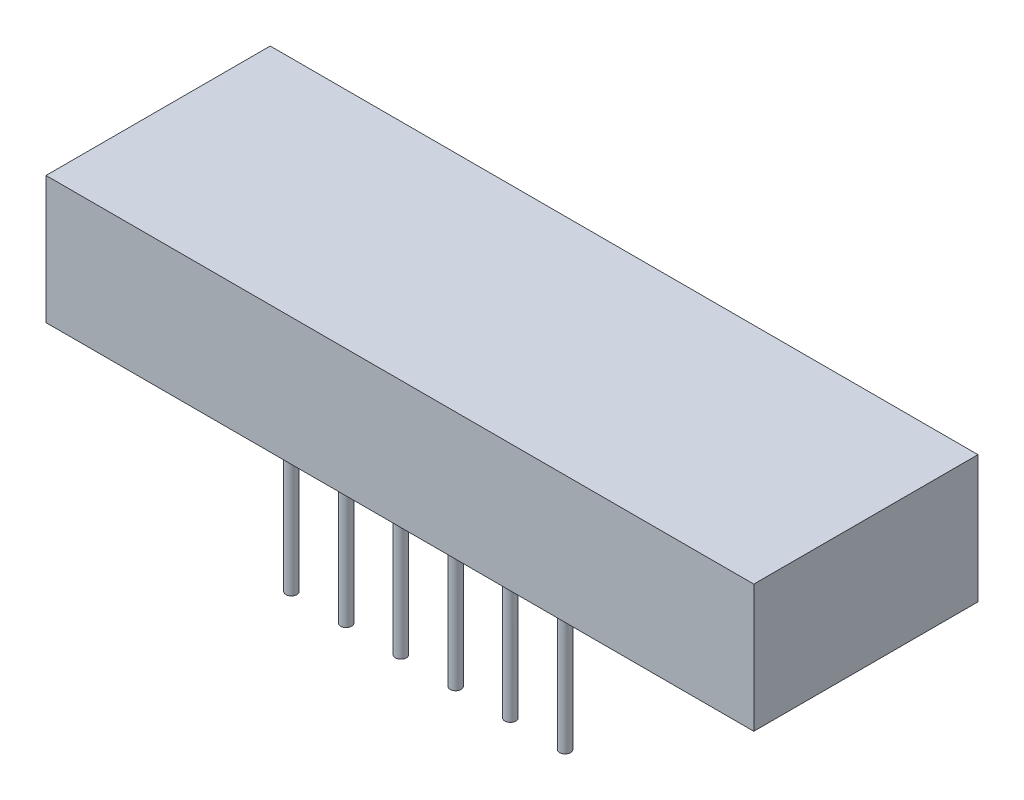
ISO-10303-21;
HEADER;
FILE_DESCRIPTION(('STEP AP214'),'2;1');
FILE_NAME('part.step','',(''),(''),'','','');
FILE_SCHEMA(('AUTOMOTIVE_DESIGN { 1 0 10303 214 1 1 1 1 }'));
ENDSEC;
DATA;
#1=APPLICATION_CONTEXT('core data for automotive mechanical design processes');
#2=APPLICATION_PROTOCOL_DEFINITION('international standard','automotive_design',2000,#1);
#3=PRODUCT_CONTEXT('',#1,'mechanical');
#4=PRODUCT('Part','Part','',(#3));
#5=PRODUCT_RELATED_PRODUCT_CATEGORY('part','',(#4));
#6=PRODUCT_DEFINITION_FORMATION('','',#4);
#7=PRODUCT_DEFINITION_CONTEXT('part definition',#1,'design');
#8=PRODUCT_DEFINITION('design','',#6,#7);
#9=PRODUCT_DEFINITION_SHAPE('','',#8);
#10=(LENGTH_UNIT() NAMED_UNIT(*) SI_UNIT(.MILLI.,.METRE.));
#11=(NAMED_UNIT(*) PLANE_ANGLE_UNIT() SI_UNIT($,.RADIAN.));
#12=(NAMED_UNIT(*) SI_UNIT($,.STERADIAN.) SOLID_ANGLE_UNIT());
#13=UNCERTAINTY_MEASURE_WITH_UNIT(LENGTH_MEASURE(1.E-05),#10,'distance_accuracy_value','');
#14=(GEOMETRIC_REPRESENTATION_CONTEXT(3) GLOBAL_UNCERTAINTY_ASSIGNED_CONTEXT((#13)) GLOBAL_UNIT_ASSIGNED_CONTEXT((#10,
#11,#12)) REPRESENTATION_CONTEXT('',''));
#15=CARTESIAN_POINT('',(0.,0.,0.));
#16=DIRECTION('',(0.,0.,1.));
#17=DIRECTION('',(1.,0.,0.));
#18=AXIS2_PLACEMENT_3D('',#15,#16,#17);
#19=CARTESIAN_POINT('',(-16.1,0.,-5.1));
#20=DIRECTION('',(0.,1.,0.));
#21=DIRECTION('',(0.,0.,1.));
#22=AXIS2_PLACEMENT_3D('',#19,#20,#21);
#23=PLANE('',#22);
#24=CARTESIAN_POINT('',(3.73481199421592,0.,-3.81));
#25=DIRECTION('',(0.,1.,0.));
#26=DIRECTION('',(0.,0.,1.));
#27=AXIS2_PLACEMENT_3D('',#24,#25,#26);
#28=CIRCLE('',#27,0.250000000000001);
#29=CARTESIAN_POINT('',(3.73481199421592,0.,-3.56));
#30=VERTEX_POINT('',#29);
#31=EDGE_CURVE('E42',#30,#30,#28,.F.);
#32=ORIENTED_EDGE('',*,*,#31,.F.);
#33=EDGE_LOOP('',(#32));
#34=FACE_BOUND('',#33,.T.);
#35=CARTESIAN_POINT('',(-1.2449373314053,0.,-3.81000000000001));
#36=DIRECTION('',(0.,1.,0.));
#37=DIRECTION('',(0.,0.,1.));
#38=AXIS2_PLACEMENT_3D('',#35,#36,#37);
#39=CIRCLE('',#38,0.25);
#40=CARTESIAN_POINT('',(-1.2449373314053,0.,-3.56));
#41=VERTEX_POINT('',#40);
#42=EDGE_CURVE('E135',#41,#41,#39,.F.);
#43=ORIENTED_EDGE('',*,*,#42,.F.);
#44=EDGE_LOOP('',(#43));
#45=FACE_BOUND('',#44,.T.);
#46=CARTESIAN_POINT('',(-6.22468665702653,0.,-3.81000000000001));
#47=DIRECTION('',(0.,1.,0.));
#48=DIRECTION('',(0.,0.,1.));
#49=AXIS2_PLACEMENT_3D('',#46,#47,#48);
#50=CIRCLE('',#49,0.25);
#51=CARTESIAN_POINT('',(-6.22468665702653,0.,-3.56));
#52=VERTEX_POINT('',#51);
#53=EDGE_CURVE('E129',#52,#52,#50,.F.);
#54=ORIENTED_EDGE('',*,*,#53,.F.);
#55=EDGE_LOOP('',(#54));
#56=FACE_BOUND('',#55,.T.);
#57=CARTESIAN_POINT('',(-3.73481199421592,0.,3.81));
#58=DIRECTION('',(0.,1.,0.));
#59=DIRECTION('',(0.,0.,1.));
#60=AXIS2_PLACEMENT_3D('',#57,#58,#59);
#61=CIRCLE('',#60,0.25);
#62=CARTESIAN_POINT('',(-3.73481199421592,0.,4.06));
#63=VERTEX_POINT('',#62);
#64=EDGE_CURVE('E123',#63,#63,#61,.F.);
#65=ORIENTED_EDGE('',*,*,#64,.F.);
#66=EDGE_LOOP('',(#65));
#67=FACE_BOUND('',#66,.T.);
#68=CARTESIAN_POINT('',(1.2449373314053,0.,3.81));
#69=DIRECTION('',(0.,1.,0.));
#70=DIRECTION('',(0.,0.,1.));
#71=AXIS2_PLACEMENT_3D('',#68,#69,#70);
#72=CIRCLE('',#71,0.25);
#73=CARTESIAN_POINT('',(1.2449373314053,0.,4.06));
#74=VERTEX_POINT('',#73);
#75=EDGE_CURVE('E117',#74,#74,#72,.F.);
#76=ORIENTED_EDGE('',*,*,#75,.F.);
#77=EDGE_LOOP('',(#76));
#78=FACE_BOUND('',#77,.T.);
#79=CARTESIAN_POINT('',(6.22468665702653,0.,3.81));
#80=DIRECTION('',(0.,1.,0.));
#81=DIRECTION('',(0.,0.,1.));
#82=AXIS2_PLACEMENT_3D('',#79,#80,#81);
#83=CIRCLE('',#82,0.25);
#84=CARTESIAN_POINT('',(6.22468665702653,0.,4.06));
#85=VERTEX_POINT('',#84);
#86=EDGE_CURVE('E111',#85,#85,#83,.F.);
#87=ORIENTED_EDGE('',*,*,#86,.F.);
#88=EDGE_LOOP('',(#87));
#89=FACE_BOUND('',#88,.T.);
#90=DIRECTION('',(0.,0.,1.));
#91=VECTOR('',#90,1.);
#92=CARTESIAN_POINT('',(-16.1,0.,-5.1));
#93=LINE('',#92,#91);
#94=CARTESIAN_POINT('',(-16.1,0.,-5.1));
#95=VERTEX_POINT('',#94);
#96=CARTESIAN_POINT('',(-16.1,0.,5.1));
#97=VERTEX_POINT('',#96);
#98=EDGE_CURVE('E101',#95,#97,#93,.T.);
#99=ORIENTED_EDGE('',*,*,#98,.F.);
#100=DIRECTION('',(-1.,0.,0.));
#101=VECTOR('',#100,1.);
#102=CARTESIAN_POINT('',(-16.1,0.,-5.1));
#103=LINE('',#102,#101);
#104=CARTESIAN_POINT('',(16.1,0.,-5.1));
#105=VERTEX_POINT('',#104);
#106=EDGE_CURVE('E73',#105,#95,#103,.T.);
#107=ORIENTED_EDGE('',*,*,#106,.F.);
#108=DIRECTION('',(0.,0.,-1.));
#109=VECTOR('',#108,1.);
#110=CARTESIAN_POINT('',(16.1,0.,-5.1));
#111=LINE('',#110,#109);
#112=CARTESIAN_POINT('',(16.1,0.,5.1));
#113=VERTEX_POINT('',#112);
#114=EDGE_CURVE('E67',#113,#105,#111,.T.);
#115=ORIENTED_EDGE('',*,*,#114,.F.);
#116=DIRECTION('',(1.,0.,0.));
#117=VECTOR('',#116,1.);
#118=CARTESIAN_POINT('',(-16.1,0.,5.1));
#119=LINE('',#118,#117);
#120=EDGE_CURVE('E91',#97,#113,#119,.T.);
#121=ORIENTED_EDGE('',*,*,#120,.F.);
#122=EDGE_LOOP('',(#99,#107,#115,#121));
#123=FACE_BOUND('',#122,.T.);
#124=CARTESIAN_POINT('',(3.73481199421592,0.,3.81));
#125=DIRECTION('',(0.,1.,0.));
#126=DIRECTION('',(0.,0.,1.));
#127=AXIS2_PLACEMENT_3D('',#124,#125,#126);
#128=CIRCLE('',#127,0.250000000000001);
#129=CARTESIAN_POINT('',(3.73481199421592,0.,4.06));
#130=VERTEX_POINT('',#129);
#131=EDGE_CURVE('E114',#130,#130,#128,.F.);
#132=ORIENTED_EDGE('',*,*,#131,.F.);
#133=EDGE_LOOP('',(#132));
#134=FACE_BOUND('',#133,.T.);
#135=CARTESIAN_POINT('',(-1.24493733140531,0.,3.81));
#136=DIRECTION('',(0.,1.,0.));
#137=DIRECTION('',(0.,0.,1.));
#138=AXIS2_PLACEMENT_3D('',#135,#136,#137);
#139=CIRCLE('',#138,0.25);
#140=CARTESIAN_POINT('',(-1.24493733140531,0.,4.06));
#141=VERTEX_POINT('',#140);
#142=EDGE_CURVE('E120',#141,#141,#139,.F.);
#143=ORIENTED_EDGE('',*,*,#142,.F.);
#144=EDGE_LOOP('',(#143));
#145=FACE_BOUND('',#144,.T.);
#146=CARTESIAN_POINT('',(-6.22468665702653,0.,3.81));
#147=DIRECTION('',(0.,1.,0.));
#148=DIRECTION('',(0.,0.,1.));
#149=AXIS2_PLACEMENT_3D('',#146,#147,#148);
#150=CIRCLE('',#149,0.25);
#151=CARTESIAN_POINT('',(-6.22468665702653,0.,4.06));
#152=VERTEX_POINT('',#151);
#153=EDGE_CURVE('E126',#152,#152,#150,.F.);
#154=ORIENTED_EDGE('',*,*,#153,.F.);
#155=EDGE_LOOP('',(#154));
#156=FACE_BOUND('',#155,.T.);
#157=CARTESIAN_POINT('',(-3.73481199421592,0.,-3.81000000000001));
#158=DIRECTION('',(0.,1.,0.));
#159=DIRECTION('',(0.,0.,1.));
#160=AXIS2_PLACEMENT_3D('',#157,#158,#159);
#161=CIRCLE('',#160,0.25);
#162=CARTESIAN_POINT('',(-3.73481199421592,0.,-3.56));
#163=VERTEX_POINT('',#162);
#164=EDGE_CURVE('E132',#163,#163,#161,.F.);
#165=ORIENTED_EDGE('',*,*,#164,.F.);
#166=EDGE_LOOP('',(#165));
#167=FACE_BOUND('',#166,.T.);
#168=CARTESIAN_POINT('',(1.24493733140531,0.,-3.81000000000001));
#169=DIRECTION('',(0.,1.,0.));
#170=DIRECTION('',(0.,0.,1.));
#171=AXIS2_PLACEMENT_3D('',#168,#169,#170);
#172=CIRCLE('',#171,0.25);
#173=CARTESIAN_POINT('',(1.24493733140531,0.,-3.56));
#174=VERTEX_POINT('',#173);
#175=EDGE_CURVE('E138',#174,#174,#172,.F.);
#176=ORIENTED_EDGE('',*,*,#175,.F.);
#177=EDGE_LOOP('',(#176));
#178=FACE_BOUND('',#177,.T.);
#179=CARTESIAN_POINT('',(6.22468665702653,0.,-3.81000000000001));
#180=DIRECTION('',(0.,1.,0.));
#181=DIRECTION('',(0.,0.,1.));
#182=AXIS2_PLACEMENT_3D('',#179,#180,#181);
#183=CIRCLE('',#182,0.25);
#184=CARTESIAN_POINT('',(6.22468665702653,0.,-3.56));
#185=VERTEX_POINT('',#184);
#186=EDGE_CURVE('E11',#185,#185,#183,.F.);
#187=ORIENTED_EDGE('',*,*,#186,.F.);
#188=EDGE_LOOP('',(#187));
#189=FACE_BOUND('',#188,.T.);
#190=ADVANCED_FACE('F33',(#34,#45,#56,#67,#78,#89,#123,#134,#145,#156,#167,#178,#189),#23,.F.);
#191=CARTESIAN_POINT('',(-16.1,5.8,-5.1));
#192=DIRECTION('',(1.,0.,0.));
#193=DIRECTION('',(0.,0.,-1.));
#194=AXIS2_PLACEMENT_3D('',#191,#192,#193);
#195=PLANE('',#194);
#196=ORIENTED_EDGE('',*,*,#98,.T.);
#197=DIRECTION('',(0.,-1.,0.));
#198=VECTOR('',#197,1.);
#199=CARTESIAN_POINT('',(-16.1,5.8,5.1));
#200=LINE('',#199,#198);
#201=CARTESIAN_POINT('',(-16.1,5.8,5.1));
#202=VERTEX_POINT('',#201);
#203=EDGE_CURVE('E92',#202,#97,#200,.T.);
#204=ORIENTED_EDGE('',*,*,#203,.F.);
#205=DIRECTION('',(0.,0.,1.));
#206=VECTOR('',#205,1.);
#207=CARTESIAN_POINT('',(-16.1,5.8,-5.1));
#208=LINE('',#207,#206);
#209=CARTESIAN_POINT('',(-16.1,5.8,-5.1));
#210=VERTEX_POINT('',#209);
#211=EDGE_CURVE('E86',#210,#202,#208,.T.);
#212=ORIENTED_EDGE('',*,*,#211,.F.);
#213=DIRECTION('',(0.,-1.,0.));
#214=VECTOR('',#213,1.);
#215=CARTESIAN_POINT('',(-16.1,5.8,-5.1));
#216=LINE('',#215,#214);
#217=EDGE_CURVE('E97',#210,#95,#216,.T.);
#218=ORIENTED_EDGE('',*,*,#217,.T.);
#219=EDGE_LOOP('',(#196,#204,#212,#218));
#220=FACE_BOUND('',#219,.T.);
#221=ADVANCED_FACE('F35',(#220),#195,.F.);
#222=CARTESIAN_POINT('',(-16.1,5.8,5.1));
#223=DIRECTION('',(0.,0.,-1.));
#224=DIRECTION('',(-1.,0.,0.));
#225=AXIS2_PLACEMENT_3D('',#222,#223,#224);
#226=PLANE('',#225);
#227=ORIENTED_EDGE('',*,*,#120,.T.);
#228=DIRECTION('',(0.,-1.,0.));
#229=VECTOR('',#228,1.);
#230=CARTESIAN_POINT('',(16.1,5.8,5.1));
#231=LINE('',#230,#229);
#232=CARTESIAN_POINT('',(16.1,5.8,5.1));
#233=VERTEX_POINT('',#232);
#234=EDGE_CURVE('E89',#233,#113,#231,.T.);
#235=ORIENTED_EDGE('',*,*,#234,.F.);
#236=DIRECTION('',(1.,0.,0.));
#237=VECTOR('',#236,1.);
#238=CARTESIAN_POINT('',(-16.1,5.8,5.1));
#239=LINE('',#238,#237);
#240=EDGE_CURVE('E81',#202,#233,#239,.T.);
#241=ORIENTED_EDGE('',*,*,#240,.F.);
#242=ORIENTED_EDGE('',*,*,#203,.T.);
#243=EDGE_LOOP('',(#227,#235,#241,#242));
#244=FACE_BOUND('',#243,.T.);
#245=ADVANCED_FACE('F90',(#244),#226,.F.);
#246=CARTESIAN_POINT('',(16.1,5.8,-5.1));
#247=DIRECTION('',(-1.,0.,0.));
#248=DIRECTION('',(0.,0.,1.));
#249=AXIS2_PLACEMENT_3D('',#246,#247,#248);
#250=PLANE('',#249);
#251=ORIENTED_EDGE('',*,*,#114,.T.);
#252=DIRECTION('',(0.,-1.,0.));
#253=VECTOR('',#252,1.);
#254=CARTESIAN_POINT('',(16.1,5.8,-5.1));
#255=LINE('',#254,#253);
#256=CARTESIAN_POINT('',(16.1,5.8,-5.1));
#257=VERTEX_POINT('',#256);
#258=EDGE_CURVE('E93',#257,#105,#255,.T.);
#259=ORIENTED_EDGE('',*,*,#258,.F.);
#260=DIRECTION('',(0.,0.,-1.));
#261=VECTOR('',#260,1.);
#262=CARTESIAN_POINT('',(16.1,5.8,-5.1));
#263=LINE('',#262,#261);
#264=EDGE_CURVE('E84',#233,#257,#263,.T.);
#265=ORIENTED_EDGE('',*,*,#264,.F.);
#266=ORIENTED_EDGE('',*,*,#234,.T.);
#267=EDGE_LOOP('',(#251,#259,#265,#266));
#268=FACE_BOUND('',#267,.T.);
#269=ADVANCED_FACE('F95',(#268),#250,.F.);
#270=CARTESIAN_POINT('',(-16.1,5.8,-5.1));
#271=DIRECTION('',(0.,0.,1.));
#272=DIRECTION('',(1.,0.,0.));
#273=AXIS2_PLACEMENT_3D('',#270,#271,#272);
#274=PLANE('',#273);
#275=ORIENTED_EDGE('',*,*,#106,.T.);
#276=ORIENTED_EDGE('',*,*,#217,.F.);
#277=DIRECTION('',(-1.,0.,0.));
#278=VECTOR('',#277,1.);
#279=CARTESIAN_POINT('',(-16.1,5.8,-5.1));
#280=LINE('',#279,#278);
#281=EDGE_CURVE('E50',#257,#210,#280,.T.);
#282=ORIENTED_EDGE('',*,*,#281,.F.);
#283=ORIENTED_EDGE('',*,*,#258,.T.);
#284=EDGE_LOOP('',(#275,#276,#282,#283));
#285=FACE_BOUND('',#284,.T.);
#286=ADVANCED_FACE('F272',(#285),#274,.F.);
#287=CARTESIAN_POINT('',(-16.1,5.8,-5.1));
#288=DIRECTION('',(0.,1.,0.));
#289=DIRECTION('',(0.,0.,1.));
#290=AXIS2_PLACEMENT_3D('',#287,#288,#289);
#291=PLANE('',#290);
#292=ORIENTED_EDGE('',*,*,#211,.T.);
#293=ORIENTED_EDGE('',*,*,#240,.T.);
#294=ORIENTED_EDGE('',*,*,#264,.T.);
#295=ORIENTED_EDGE('',*,*,#281,.T.);
#296=EDGE_LOOP('',(#292,#293,#294,#295));
#297=FACE_BOUND('',#296,.T.);
#298=ADVANCED_FACE('F82',(#297),#291,.T.);
#299=CARTESIAN_POINT('',(6.22468665702653,-6.3,3.81));
#300=DIRECTION('',(0.,1.,0.));
#301=DIRECTION('',(0.,0.,1.));
#302=AXIS2_PLACEMENT_3D('',#299,#300,#301);
#303=CYLINDRICAL_SURFACE('',#302,0.25);
#304=CARTESIAN_POINT('',(6.22468665702653,-6.3,3.81));
#305=DIRECTION('',(0.,-1.,0.));
#306=DIRECTION('',(0.,0.,-1.));
#307=AXIS2_PLACEMENT_3D('',#304,#305,#306);
#308=CIRCLE('',#307,0.25);
#309=CARTESIAN_POINT('',(6.22468665702653,-6.3,3.56));
#310=VERTEX_POINT('',#309);
#311=EDGE_CURVE('E104',#310,#310,#308,.T.);
#312=ORIENTED_EDGE('',*,*,#311,.F.);
#313=EDGE_LOOP('',(#312));
#314=FACE_BOUND('',#313,.T.);
#315=ORIENTED_EDGE('',*,*,#86,.T.);
#316=EDGE_LOOP('',(#315));
#317=FACE_BOUND('',#316,.T.);
#318=ADVANCED_FACE('F266',(#314,#317),#303,.T.);
#319=CARTESIAN_POINT('',(6.22468665702653,-6.3,3.81));
#320=DIRECTION('',(0.,-1.,0.));
#321=DIRECTION('',(0.,0.,-1.));
#322=AXIS2_PLACEMENT_3D('',#319,#320,#321);
#323=PLANE('',#322);
#324=ORIENTED_EDGE('',*,*,#311,.T.);
#325=EDGE_LOOP('',(#324));
#326=FACE_BOUND('',#325,.T.);
#327=ADVANCED_FACE('F262',(#326),#323,.T.);
#328=CARTESIAN_POINT('',(3.73481199421592,-6.3,3.81));
#329=DIRECTION('',(0.,1.,0.));
#330=DIRECTION('',(0.,0.,1.));
#331=AXIS2_PLACEMENT_3D('',#328,#329,#330);
#332=CYLINDRICAL_SURFACE('',#331,0.250000000000001);
#333=CARTESIAN_POINT('',(3.73481199421592,-6.3,3.81));
#334=DIRECTION('',(0.,-1.,0.));
#335=DIRECTION('',(0.,0.,-1.));
#336=AXIS2_PLACEMENT_3D('',#333,#334,#335);
#337=CIRCLE('',#336,0.250000000000001);
#338=CARTESIAN_POINT('',(3.73481199421592,-6.3,3.56));
#339=VERTEX_POINT('',#338);
#340=EDGE_CURVE('E287',#339,#339,#337,.T.);
#341=ORIENTED_EDGE('',*,*,#340,.F.);
#342=EDGE_LOOP('',(#341));
#343=FACE_BOUND('',#342,.T.);
#344=ORIENTED_EDGE('',*,*,#131,.T.);
#345=EDGE_LOOP('',(#344));
#346=FACE_BOUND('',#345,.T.);
#347=ADVANCED_FACE('F258',(#343,#346),#332,.T.);
#348=CARTESIAN_POINT('',(3.73481199421592,-6.3,3.81));
#349=DIRECTION('',(0.,-1.,0.));
#350=DIRECTION('',(0.,0.,-1.));
#351=AXIS2_PLACEMENT_3D('',#348,#349,#350);
#352=PLANE('',#351);
#353=ORIENTED_EDGE('',*,*,#340,.T.);
#354=EDGE_LOOP('',(#353));
#355=FACE_BOUND('',#354,.T.);
#356=ADVANCED_FACE('F254',(#355),#352,.T.);
#357=CARTESIAN_POINT('',(1.2449373314053,-6.3,3.81));
#358=DIRECTION('',(0.,1.,0.));
#359=DIRECTION('',(0.,0.,1.));
#360=AXIS2_PLACEMENT_3D('',#357,#358,#359);
#361=CYLINDRICAL_SURFACE('',#360,0.25);
#362=CARTESIAN_POINT('',(1.2449373314053,-6.3,3.81));
#363=DIRECTION('',(0.,-1.,0.));
#364=DIRECTION('',(0.,0.,-1.));
#365=AXIS2_PLACEMENT_3D('',#362,#363,#364);
#366=CIRCLE('',#365,0.25);
#367=CARTESIAN_POINT('',(1.2449373314053,-6.3,3.56));
#368=VERTEX_POINT('',#367);
#369=EDGE_CURVE('E290',#368,#368,#366,.T.);
#370=ORIENTED_EDGE('',*,*,#369,.F.);
#371=EDGE_LOOP('',(#370));
#372=FACE_BOUND('',#371,.T.);
#373=ORIENTED_EDGE('',*,*,#75,.T.);
#374=EDGE_LOOP('',(#373));
#375=FACE_BOUND('',#374,.T.);
#376=ADVANCED_FACE('F250',(#372,#375),#361,.T.);
#377=CARTESIAN_POINT('',(1.2449373314053,-6.3,3.81));
#378=DIRECTION('',(0.,-1.,0.));
#379=DIRECTION('',(0.,0.,-1.));
#380=AXIS2_PLACEMENT_3D('',#377,#378,#379);
#381=PLANE('',#380);
#382=ORIENTED_EDGE('',*,*,#369,.T.);
#383=EDGE_LOOP('',(#382));
#384=FACE_BOUND('',#383,.T.);
#385=ADVANCED_FACE('F246',(#384),#381,.T.);
#386=CARTESIAN_POINT('',(-1.24493733140531,-6.3,3.81));
#387=DIRECTION('',(0.,1.,0.));
#388=DIRECTION('',(0.,0.,1.));
#389=AXIS2_PLACEMENT_3D('',#386,#387,#388);
#390=CYLINDRICAL_SURFACE('',#389,0.25);
#391=CARTESIAN_POINT('',(-1.24493733140531,-6.3,3.81));
#392=DIRECTION('',(0.,-1.,0.));
#393=DIRECTION('',(0.,0.,-1.));
#394=AXIS2_PLACEMENT_3D('',#391,#392,#393);
#395=CIRCLE('',#394,0.25);
#396=CARTESIAN_POINT('',(-1.24493733140531,-6.3,3.56));
#397=VERTEX_POINT('',#396);
#398=EDGE_CURVE('E293',#397,#397,#395,.T.);
#399=ORIENTED_EDGE('',*,*,#398,.F.);
#400=EDGE_LOOP('',(#399));
#401=FACE_BOUND('',#400,.T.);
#402=ORIENTED_EDGE('',*,*,#142,.T.);
#403=EDGE_LOOP('',(#402));
#404=FACE_BOUND('',#403,.T.);
#405=ADVANCED_FACE('F242',(#401,#404),#390,.T.);
#406=CARTESIAN_POINT('',(-1.24493733140531,-6.3,3.81));
#407=DIRECTION('',(0.,-1.,0.));
#408=DIRECTION('',(0.,0.,-1.));
#409=AXIS2_PLACEMENT_3D('',#406,#407,#408);
#410=PLANE('',#409);
#411=ORIENTED_EDGE('',*,*,#398,.T.);
#412=EDGE_LOOP('',(#411));
#413=FACE_BOUND('',#412,.T.);
#414=ADVANCED_FACE('F238',(#413),#410,.T.);
#415=CARTESIAN_POINT('',(-3.73481199421592,-6.3,3.81));
#416=DIRECTION('',(0.,1.,0.));
#417=DIRECTION('',(0.,0.,1.));
#418=AXIS2_PLACEMENT_3D('',#415,#416,#417);
#419=CYLINDRICAL_SURFACE('',#418,0.25);
#420=CARTESIAN_POINT('',(-3.73481199421592,-6.3,3.81));
#421=DIRECTION('',(0.,-1.,0.));
#422=DIRECTION('',(0.,0.,-1.));
#423=AXIS2_PLACEMENT_3D('',#420,#421,#422);
#424=CIRCLE('',#423,0.25);
#425=CARTESIAN_POINT('',(-3.73481199421592,-6.3,3.56));
#426=VERTEX_POINT('',#425);
#427=EDGE_CURVE('E296',#426,#426,#424,.T.);
#428=ORIENTED_EDGE('',*,*,#427,.F.);
#429=EDGE_LOOP('',(#428));
#430=FACE_BOUND('',#429,.T.);
#431=ORIENTED_EDGE('',*,*,#64,.T.);
#432=EDGE_LOOP('',(#431));
#433=FACE_BOUND('',#432,.T.);
#434=ADVANCED_FACE('F234',(#430,#433),#419,.T.);
#435=CARTESIAN_POINT('',(-3.73481199421592,-6.3,3.81));
#436=DIRECTION('',(0.,-1.,0.));
#437=DIRECTION('',(0.,0.,-1.));
#438=AXIS2_PLACEMENT_3D('',#435,#436,#437);
#439=PLANE('',#438);
#440=ORIENTED_EDGE('',*,*,#427,.T.);
#441=EDGE_LOOP('',(#440));
#442=FACE_BOUND('',#441,.T.);
#443=ADVANCED_FACE('F230',(#442),#439,.T.);
#444=CARTESIAN_POINT('',(-6.22468665702653,-6.3,3.81));
#445=DIRECTION('',(0.,1.,0.));
#446=DIRECTION('',(0.,0.,1.));
#447=AXIS2_PLACEMENT_3D('',#444,#445,#446);
#448=CYLINDRICAL_SURFACE('',#447,0.25);
#449=CARTESIAN_POINT('',(-6.22468665702653,-6.3,3.81));
#450=DIRECTION('',(0.,-1.,0.));
#451=DIRECTION('',(0.,0.,-1.));
#452=AXIS2_PLACEMENT_3D('',#449,#450,#451);
#453=CIRCLE('',#452,0.25);
#454=CARTESIAN_POINT('',(-6.22468665702653,-6.3,3.56));
#455=VERTEX_POINT('',#454);
#456=EDGE_CURVE('E299',#455,#455,#453,.T.);
#457=ORIENTED_EDGE('',*,*,#456,.F.);
#458=EDGE_LOOP('',(#457));
#459=FACE_BOUND('',#458,.T.);
#460=ORIENTED_EDGE('',*,*,#153,.T.);
#461=EDGE_LOOP('',(#460));
#462=FACE_BOUND('',#461,.T.);
#463=ADVANCED_FACE('F226',(#459,#462),#448,.T.);
#464=CARTESIAN_POINT('',(-6.22468665702653,-6.3,3.81));
#465=DIRECTION('',(0.,-1.,0.));
#466=DIRECTION('',(0.,0.,-1.));
#467=AXIS2_PLACEMENT_3D('',#464,#465,#466);
#468=PLANE('',#467);
#469=ORIENTED_EDGE('',*,*,#456,.T.);
#470=EDGE_LOOP('',(#469));
#471=FACE_BOUND('',#470,.T.);
#472=ADVANCED_FACE('F222',(#471),#468,.T.);
#473=CARTESIAN_POINT('',(-6.22468665702653,-6.3,-3.81000000000001));
#474=DIRECTION('',(0.,1.,0.));
#475=DIRECTION('',(0.,0.,1.));
#476=AXIS2_PLACEMENT_3D('',#473,#474,#475);
#477=CYLINDRICAL_SURFACE('',#476,0.25);
#478=CARTESIAN_POINT('',(-6.22468665702653,-6.3,-3.81000000000001));
#479=DIRECTION('',(0.,-1.,0.));
#480=DIRECTION('',(0.,0.,1.));
#481=AXIS2_PLACEMENT_3D('',#478,#479,#480);
#482=CIRCLE('',#481,0.25);
#483=CARTESIAN_POINT('',(-6.22468665702653,-6.3,-3.56));
#484=VERTEX_POINT('',#483);
#485=EDGE_CURVE('E302',#484,#484,#482,.T.);
#486=ORIENTED_EDGE('',*,*,#485,.F.);
#487=EDGE_LOOP('',(#486));
#488=FACE_BOUND('',#487,.T.);
#489=ORIENTED_EDGE('',*,*,#53,.T.);
#490=EDGE_LOOP('',(#489));
#491=FACE_BOUND('',#490,.T.);
#492=ADVANCED_FACE('F218',(#488,#491),#477,.T.);
#493=CARTESIAN_POINT('',(-6.22468665702653,-6.3,-3.81000000000001));
#494=DIRECTION('',(0.,1.,0.));
#495=DIRECTION('',(0.,0.,1.));
#496=AXIS2_PLACEMENT_3D('',#493,#494,#495);
#497=PLANE('',#496);
#498=ORIENTED_EDGE('',*,*,#485,.T.);
#499=EDGE_LOOP('',(#498));
#500=FACE_BOUND('',#499,.T.);
#501=ADVANCED_FACE('F214',(#500),#497,.F.);
#502=CARTESIAN_POINT('',(-3.73481199421592,-6.3,-3.81000000000001));
#503=DIRECTION('',(0.,1.,0.));
#504=DIRECTION('',(0.,0.,1.));
#505=AXIS2_PLACEMENT_3D('',#502,#503,#504);
#506=CYLINDRICAL_SURFACE('',#505,0.25);
#507=CARTESIAN_POINT('',(-3.73481199421592,-6.3,-3.81000000000001));
#508=DIRECTION('',(0.,-1.,0.));
#509=DIRECTION('',(0.,0.,1.));
#510=AXIS2_PLACEMENT_3D('',#507,#508,#509);
#511=CIRCLE('',#510,0.25);
#512=CARTESIAN_POINT('',(-3.73481199421592,-6.3,-3.56));
#513=VERTEX_POINT('',#512);
#514=EDGE_CURVE('E305',#513,#513,#511,.T.);
#515=ORIENTED_EDGE('',*,*,#514,.F.);
#516=EDGE_LOOP('',(#515));
#517=FACE_BOUND('',#516,.T.);
#518=ORIENTED_EDGE('',*,*,#164,.T.);
#519=EDGE_LOOP('',(#518));
#520=FACE_BOUND('',#519,.T.);
#521=ADVANCED_FACE('F210',(#517,#520),#506,.T.);
#522=CARTESIAN_POINT('',(-3.73481199421592,-6.3,-3.81000000000001));
#523=DIRECTION('',(0.,1.,0.));
#524=DIRECTION('',(0.,0.,1.));
#525=AXIS2_PLACEMENT_3D('',#522,#523,#524);
#526=PLANE('',#525);
#527=ORIENTED_EDGE('',*,*,#514,.T.);
#528=EDGE_LOOP('',(#527));
#529=FACE_BOUND('',#528,.T.);
#530=ADVANCED_FACE('F206',(#529),#526,.F.);
#531=CARTESIAN_POINT('',(-1.2449373314053,-6.3,-3.81000000000001));
#532=DIRECTION('',(0.,1.,0.));
#533=DIRECTION('',(0.,0.,1.));
#534=AXIS2_PLACEMENT_3D('',#531,#532,#533);
#535=CYLINDRICAL_SURFACE('',#534,0.25);
#536=CARTESIAN_POINT('',(-1.2449373314053,-6.3,-3.81000000000001));
#537=DIRECTION('',(0.,-1.,0.));
#538=DIRECTION('',(0.,0.,1.));
#539=AXIS2_PLACEMENT_3D('',#536,#537,#538);
#540=CIRCLE('',#539,0.25);
#541=CARTESIAN_POINT('',(-1.2449373314053,-6.3,-3.56));
#542=VERTEX_POINT('',#541);
#543=EDGE_CURVE('E308',#542,#542,#540,.T.);
#544=ORIENTED_EDGE('',*,*,#543,.F.);
#545=EDGE_LOOP('',(#544));
#546=FACE_BOUND('',#545,.T.);
#547=ORIENTED_EDGE('',*,*,#42,.T.);
#548=EDGE_LOOP('',(#547));
#549=FACE_BOUND('',#548,.T.);
#550=ADVANCED_FACE('F202',(#546,#549),#535,.T.);
#551=CARTESIAN_POINT('',(-1.2449373314053,-6.3,-3.81000000000001));
#552=DIRECTION('',(0.,1.,0.));
#553=DIRECTION('',(0.,0.,1.));
#554=AXIS2_PLACEMENT_3D('',#551,#552,#553);
#555=PLANE('',#554);
#556=ORIENTED_EDGE('',*,*,#543,.T.);
#557=EDGE_LOOP('',(#556));
#558=FACE_BOUND('',#557,.T.);
#559=ADVANCED_FACE('F198',(#558),#555,.F.);
#560=CARTESIAN_POINT('',(1.24493733140531,-6.3,-3.81000000000001));
#561=DIRECTION('',(0.,1.,0.));
#562=DIRECTION('',(0.,0.,1.));
#563=AXIS2_PLACEMENT_3D('',#560,#561,#562);
#564=CYLINDRICAL_SURFACE('',#563,0.25);
#565=CARTESIAN_POINT('',(1.24493733140531,-6.3,-3.81000000000001));
#566=DIRECTION('',(0.,-1.,0.));
#567=DIRECTION('',(0.,0.,1.));
#568=AXIS2_PLACEMENT_3D('',#565,#566,#567);
#569=CIRCLE('',#568,0.25);
#570=CARTESIAN_POINT('',(1.24493733140531,-6.3,-3.56));
#571=VERTEX_POINT('',#570);
#572=EDGE_CURVE('E311',#571,#571,#569,.T.);
#573=ORIENTED_EDGE('',*,*,#572,.F.);
#574=EDGE_LOOP('',(#573));
#575=FACE_BOUND('',#574,.T.);
#576=ORIENTED_EDGE('',*,*,#175,.T.);
#577=EDGE_LOOP('',(#576));
#578=FACE_BOUND('',#577,.T.);
#579=ADVANCED_FACE('F194',(#575,#578),#564,.T.);
#580=CARTESIAN_POINT('',(1.24493733140531,-6.3,-3.81000000000001));
#581=DIRECTION('',(0.,1.,0.));
#582=DIRECTION('',(0.,0.,1.));
#583=AXIS2_PLACEMENT_3D('',#580,#581,#582);
#584=PLANE('',#583);
#585=ORIENTED_EDGE('',*,*,#572,.T.);
#586=EDGE_LOOP('',(#585));
#587=FACE_BOUND('',#586,.T.);
#588=ADVANCED_FACE('F190',(#587),#584,.F.);
#589=CARTESIAN_POINT('',(3.73481199421592,-6.3,-3.81));
#590=DIRECTION('',(0.,1.,0.));
#591=DIRECTION('',(0.,0.,1.));
#592=AXIS2_PLACEMENT_3D('',#589,#590,#591);
#593=CYLINDRICAL_SURFACE('',#592,0.250000000000001);
#594=CARTESIAN_POINT('',(3.73481199421592,-6.3,-3.81));
#595=DIRECTION('',(0.,-1.,0.));
#596=DIRECTION('',(0.,0.,1.));
#597=AXIS2_PLACEMENT_3D('',#594,#595,#596);
#598=CIRCLE('',#597,0.250000000000001);
#599=CARTESIAN_POINT('',(3.73481199421592,-6.3,-3.56));
#600=VERTEX_POINT('',#599);
#601=EDGE_CURVE('E314',#600,#600,#598,.T.);
#602=ORIENTED_EDGE('',*,*,#601,.F.);
#603=EDGE_LOOP('',(#602));
#604=FACE_BOUND('',#603,.T.);
#605=ORIENTED_EDGE('',*,*,#31,.T.);
#606=EDGE_LOOP('',(#605));
#607=FACE_BOUND('',#606,.T.);
#608=ADVANCED_FACE('F143',(#604,#607),#593,.T.);
#609=CARTESIAN_POINT('',(3.73481199421592,-6.3,-3.81));
#610=DIRECTION('',(0.,1.,0.));
#611=DIRECTION('',(0.,0.,1.));
#612=AXIS2_PLACEMENT_3D('',#609,#610,#611);
#613=PLANE('',#612);
#614=ORIENTED_EDGE('',*,*,#601,.T.);
#615=EDGE_LOOP('',(#614));
#616=FACE_BOUND('',#615,.T.);
#617=ADVANCED_FACE('F175',(#616),#613,.F.);
#618=CARTESIAN_POINT('',(6.22468665702653,-6.3,-3.81000000000001));
#619=DIRECTION('',(0.,1.,0.));
#620=DIRECTION('',(0.,0.,1.));
#621=AXIS2_PLACEMENT_3D('',#618,#619,#620);
#622=CYLINDRICAL_SURFACE('',#621,0.25);
#623=CARTESIAN_POINT('',(6.22468665702653,-6.3,-3.81000000000001));
#624=DIRECTION('',(0.,-1.,0.));
#625=DIRECTION('',(0.,0.,1.));
#626=AXIS2_PLACEMENT_3D('',#623,#624,#625);
#627=CIRCLE('',#626,0.25);
#628=CARTESIAN_POINT('',(6.22468665702653,-6.3,-3.56));
#629=VERTEX_POINT('',#628);
#630=EDGE_CURVE('E317',#629,#629,#627,.T.);
#631=ORIENTED_EDGE('',*,*,#630,.F.);
#632=EDGE_LOOP('',(#631));
#633=FACE_BOUND('',#632,.T.);
#634=ORIENTED_EDGE('',*,*,#186,.T.);
#635=EDGE_LOOP('',(#634));
#636=FACE_BOUND('',#635,.T.);
#637=ADVANCED_FACE('F172',(#633,#636),#622,.T.);
#638=CARTESIAN_POINT('',(6.22468665702653,-6.3,-3.81000000000001));
#639=DIRECTION('',(0.,1.,0.));
#640=DIRECTION('',(0.,0.,1.));
#641=AXIS2_PLACEMENT_3D('',#638,#639,#640);
#642=PLANE('',#641);
#643=ORIENTED_EDGE('',*,*,#630,.T.);
#644=EDGE_LOOP('',(#643));
#645=FACE_BOUND('',#644,.T.);
#646=ADVANCED_FACE('F174',(#645),#642,.F.);
#647=CLOSED_SHELL('',(#190,#221,#245,#269,#286,#298,#318,#327,#347,#356,#376,#385,#405,#414,
#434,#443,#463,#472,#492,#501,#521,#530,#550,#559,#579,#588,#608,#617,#637,#646));
#648=MANIFOLD_SOLID_BREP('B2',#647);
#649=ADVANCED_BREP_SHAPE_REPRESENTATION('',(#18,#648),#14);
#650=SHAPE_DEFINITION_REPRESENTATION(#9,#649);
ENDSEC;
END-ISO-10303-21;
